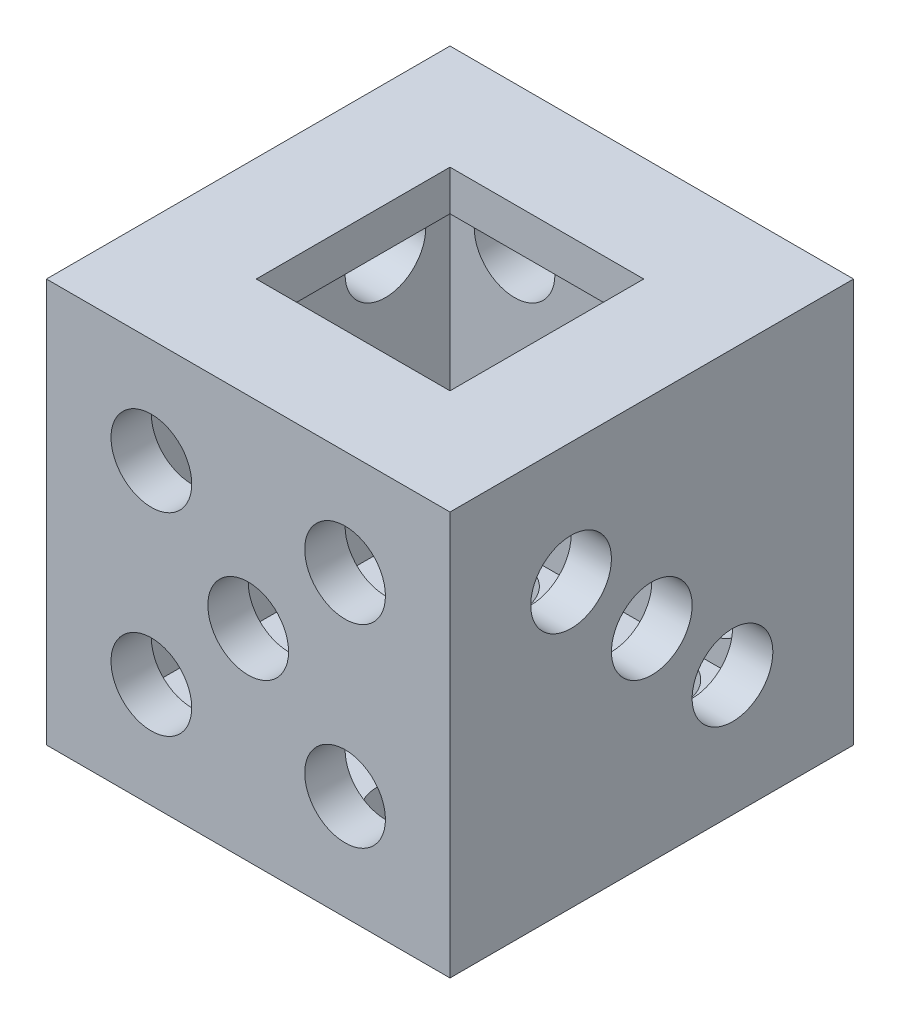
ISO-10303-21;
HEADER;
FILE_DESCRIPTION(('STEP AP214'),'2;1');
FILE_NAME('part.step','',(''),(''),'','','');
FILE_SCHEMA(('AUTOMOTIVE_DESIGN { 1 0 10303 214 1 1 1 1 }'));
ENDSEC;
DATA;
#1=APPLICATION_CONTEXT('core data for automotive mechanical design processes');
#2=APPLICATION_PROTOCOL_DEFINITION('international standard','automotive_design',2000,#1);
#3=PRODUCT_CONTEXT('',#1,'mechanical');
#4=PRODUCT('Part','Part','',(#3));
#5=PRODUCT_RELATED_PRODUCT_CATEGORY('part','',(#4));
#6=PRODUCT_DEFINITION_FORMATION('','',#4);
#7=PRODUCT_DEFINITION_CONTEXT('part definition',#1,'design');
#8=PRODUCT_DEFINITION('design','',#6,#7);
#9=PRODUCT_DEFINITION_SHAPE('','',#8);
#10=(LENGTH_UNIT() NAMED_UNIT(*) SI_UNIT(.MILLI.,.METRE.));
#11=(NAMED_UNIT(*) PLANE_ANGLE_UNIT() SI_UNIT($,.RADIAN.));
#12=(NAMED_UNIT(*) SI_UNIT($,.STERADIAN.) SOLID_ANGLE_UNIT());
#13=UNCERTAINTY_MEASURE_WITH_UNIT(LENGTH_MEASURE(1.E-05),#10,'distance_accuracy_value','');
#14=(GEOMETRIC_REPRESENTATION_CONTEXT(3) GLOBAL_UNCERTAINTY_ASSIGNED_CONTEXT((#13)) GLOBAL_UNIT_ASSIGNED_CONTEXT((#10,
#11,#12)) REPRESENTATION_CONTEXT('',''));
#15=CARTESIAN_POINT('',(0.,0.,0.));
#16=DIRECTION('',(0.,0.,1.));
#17=DIRECTION('',(1.,0.,0.));
#18=AXIS2_PLACEMENT_3D('',#15,#16,#17);
#19=CARTESIAN_POINT('',(10.,25.,-12.5));
#20=DIRECTION('',(-1.,0.,0.));
#21=DIRECTION('',(0.,0.,1.));
#22=AXIS2_PLACEMENT_3D('',#19,#20,#21);
#23=PLANE('',#22);
#24=CARTESIAN_POINT('',(10.,7.50000000000005,-5.));
#25=DIRECTION('',(-1.,0.,0.));
#26=DIRECTION('',(0.,0.,1.));
#27=AXIS2_PLACEMENT_3D('',#24,#25,#26);
#28=CIRCLE('',#27,2.5);
#29=CARTESIAN_POINT('',(10.,7.50000000000005,-2.5));
#30=VERTEX_POINT('',#29);
#31=EDGE_CURVE('E706',#30,#30,#28,.T.);
#32=ORIENTED_EDGE('',*,*,#31,.F.);
#33=EDGE_LOOP('',(#32));
#34=FACE_BOUND('',#33,.T.);
#35=CARTESIAN_POINT('',(10.,12.5,0.));
#36=DIRECTION('',(-1.,0.,0.));
#37=DIRECTION('',(0.,0.,1.));
#38=AXIS2_PLACEMENT_3D('',#35,#36,#37);
#39=CIRCLE('',#38,2.5);
#40=CARTESIAN_POINT('',(10.,12.5,2.5));
#41=VERTEX_POINT('',#40);
#42=EDGE_CURVE('E702',#41,#41,#39,.T.);
#43=ORIENTED_EDGE('',*,*,#42,.F.);
#44=EDGE_LOOP('',(#43));
#45=FACE_BOUND('',#44,.T.);
#46=CARTESIAN_POINT('',(10.,17.5,5.));
#47=DIRECTION('',(-1.,0.,0.));
#48=DIRECTION('',(0.,0.,1.));
#49=AXIS2_PLACEMENT_3D('',#46,#47,#48);
#50=CIRCLE('',#49,2.5);
#51=CARTESIAN_POINT('',(10.,17.5,7.5));
#52=VERTEX_POINT('',#51);
#53=EDGE_CURVE('E714',#52,#52,#50,.T.);
#54=ORIENTED_EDGE('',*,*,#53,.F.);
#55=EDGE_LOOP('',(#54));
#56=FACE_BOUND('',#55,.T.);
#57=DIRECTION('',(0.,0.,-1.));
#58=VECTOR('',#57,1.);
#59=CARTESIAN_POINT('',(10.,2.5,-12.5));
#60=LINE('',#59,#58);
#61=CARTESIAN_POINT('',(10.,2.5,10.));
#62=VERTEX_POINT('',#61);
#63=CARTESIAN_POINT('',(10.,2.5,-10.));
#64=VERTEX_POINT('',#63);
#65=EDGE_CURVE('E206',#62,#64,#60,.T.);
#66=ORIENTED_EDGE('',*,*,#65,.F.);
#67=DIRECTION('',(0.,-1.,0.));
#68=VECTOR('',#67,1.);
#69=CARTESIAN_POINT('',(10.,25.,10.));
#70=LINE('',#69,#68);
#71=CARTESIAN_POINT('',(10.,22.5,10.));
#72=VERTEX_POINT('',#71);
#73=EDGE_CURVE('E242',#72,#62,#70,.T.);
#74=ORIENTED_EDGE('',*,*,#73,.F.);
#75=DIRECTION('',(0.,0.,-1.));
#76=VECTOR('',#75,1.);
#77=CARTESIAN_POINT('',(10.,22.5,-12.5));
#78=LINE('',#77,#76);
#79=CARTESIAN_POINT('',(10.,22.5,-10.));
#80=VERTEX_POINT('',#79);
#81=EDGE_CURVE('E217',#72,#80,#78,.T.);
#82=ORIENTED_EDGE('',*,*,#81,.T.);
#83=DIRECTION('',(0.,-1.,0.));
#84=VECTOR('',#83,1.);
#85=CARTESIAN_POINT('',(10.,25.,-10.));
#86=LINE('',#85,#84);
#87=EDGE_CURVE('E235',#80,#64,#86,.T.);
#88=ORIENTED_EDGE('',*,*,#87,.T.);
#89=EDGE_LOOP('',(#66,#74,#82,#88));
#90=FACE_BOUND('',#89,.T.);
#91=ADVANCED_FACE('F39',(#34,#45,#56,#90),#23,.T.);
#92=CARTESIAN_POINT('',(-12.5,25.,-10.));
#93=DIRECTION('',(0.,0.,1.));
#94=DIRECTION('',(1.,0.,0.));
#95=AXIS2_PLACEMENT_3D('',#92,#93,#94);
#96=PLANE('',#95);
#97=CARTESIAN_POINT('',(6.,6.5,-10.));
#98=DIRECTION('',(0.,0.,1.));
#99=DIRECTION('',(1.,0.,0.));
#100=AXIS2_PLACEMENT_3D('',#97,#98,#99);
#101=CIRCLE('',#100,2.5);
#102=CARTESIAN_POINT('',(8.5,6.5,-10.));
#103=VERTEX_POINT('',#102);
#104=EDGE_CURVE('E605',#103,#103,#101,.T.);
#105=ORIENTED_EDGE('',*,*,#104,.F.);
#106=EDGE_LOOP('',(#105));
#107=FACE_BOUND('',#106,.T.);
#108=CARTESIAN_POINT('',(-6.,18.5,-10.));
#109=DIRECTION('',(0.,0.,1.));
#110=DIRECTION('',(1.,0.,0.));
#111=AXIS2_PLACEMENT_3D('',#108,#109,#110);
#112=CIRCLE('',#111,2.5);
#113=CARTESIAN_POINT('',(-3.5,18.5,-10.));
#114=VERTEX_POINT('',#113);
#115=EDGE_CURVE('E610',#114,#114,#112,.T.);
#116=ORIENTED_EDGE('',*,*,#115,.F.);
#117=EDGE_LOOP('',(#116));
#118=FACE_BOUND('',#117,.T.);
#119=DIRECTION('',(-1.,0.,0.));
#120=VECTOR('',#119,1.);
#121=CARTESIAN_POINT('',(-12.5,2.5,-10.));
#122=LINE('',#121,#120);
#123=CARTESIAN_POINT('',(-10.,2.5,-10.));
#124=VERTEX_POINT('',#123);
#125=EDGE_CURVE('E239',#64,#124,#122,.T.);
#126=ORIENTED_EDGE('',*,*,#125,.F.);
#127=ORIENTED_EDGE('',*,*,#87,.F.);
#128=DIRECTION('',(-1.,0.,0.));
#129=VECTOR('',#128,1.);
#130=CARTESIAN_POINT('',(-12.5,22.5,-10.));
#131=LINE('',#130,#129);
#132=CARTESIAN_POINT('',(-10.,22.5,-10.));
#133=VERTEX_POINT('',#132);
#134=EDGE_CURVE('E214',#80,#133,#131,.T.);
#135=ORIENTED_EDGE('',*,*,#134,.T.);
#136=DIRECTION('',(0.,-1.,0.));
#137=VECTOR('',#136,1.);
#138=CARTESIAN_POINT('',(-10.,25.,-10.));
#139=LINE('',#138,#137);
#140=EDGE_CURVE('E228',#133,#124,#139,.T.);
#141=ORIENTED_EDGE('',*,*,#140,.T.);
#142=EDGE_LOOP('',(#126,#127,#135,#141));
#143=FACE_BOUND('',#142,.T.);
#144=ADVANCED_FACE('F272',(#107,#118,#143),#96,.T.);
#145=CARTESIAN_POINT('',(-10.,25.,-12.5));
#146=DIRECTION('',(1.,0.,0.));
#147=DIRECTION('',(0.,0.,-1.));
#148=AXIS2_PLACEMENT_3D('',#145,#146,#147);
#149=PLANE('',#148);
#150=CARTESIAN_POINT('',(-10.,6.5,-6.));
#151=DIRECTION('',(1.,0.,0.));
#152=DIRECTION('',(0.,0.,-1.));
#153=AXIS2_PLACEMENT_3D('',#150,#151,#152);
#154=CIRCLE('',#153,2.5);
#155=CARTESIAN_POINT('',(-10.,6.5,-8.5));
#156=VERTEX_POINT('',#155);
#157=EDGE_CURVE('E674',#156,#156,#154,.T.);
#158=ORIENTED_EDGE('',*,*,#157,.F.);
#159=EDGE_LOOP('',(#158));
#160=FACE_BOUND('',#159,.T.);
#161=CARTESIAN_POINT('',(-10.,6.5,6.));
#162=DIRECTION('',(1.,0.,0.));
#163=DIRECTION('',(0.,0.,-1.));
#164=AXIS2_PLACEMENT_3D('',#161,#162,#163);
#165=CIRCLE('',#164,2.5);
#166=CARTESIAN_POINT('',(-10.,6.5,3.5));
#167=VERTEX_POINT('',#166);
#168=EDGE_CURVE('E667',#167,#167,#165,.T.);
#169=ORIENTED_EDGE('',*,*,#168,.F.);
#170=EDGE_LOOP('',(#169));
#171=FACE_BOUND('',#170,.T.);
#172=CARTESIAN_POINT('',(-10.,18.5,6.));
#173=DIRECTION('',(1.,0.,0.));
#174=DIRECTION('',(0.,0.,-1.));
#175=AXIS2_PLACEMENT_3D('',#172,#173,#174);
#176=CIRCLE('',#175,2.5);
#177=CARTESIAN_POINT('',(-10.,18.5,3.5));
#178=VERTEX_POINT('',#177);
#179=EDGE_CURVE('E682',#178,#178,#176,.T.);
#180=ORIENTED_EDGE('',*,*,#179,.F.);
#181=EDGE_LOOP('',(#180));
#182=FACE_BOUND('',#181,.T.);
#183=CARTESIAN_POINT('',(-10.,18.5,-6.));
#184=DIRECTION('',(1.,0.,0.));
#185=DIRECTION('',(0.,0.,-1.));
#186=AXIS2_PLACEMENT_3D('',#183,#184,#185);
#187=CIRCLE('',#186,2.5);
#188=CARTESIAN_POINT('',(-10.,18.5,-8.5));
#189=VERTEX_POINT('',#188);
#190=EDGE_CURVE('E690',#189,#189,#187,.T.);
#191=ORIENTED_EDGE('',*,*,#190,.F.);
#192=EDGE_LOOP('',(#191));
#193=FACE_BOUND('',#192,.T.);
#194=DIRECTION('',(0.,0.,1.));
#195=VECTOR('',#194,1.);
#196=CARTESIAN_POINT('',(-10.,2.5,-12.5));
#197=LINE('',#196,#195);
#198=CARTESIAN_POINT('',(-10.,2.5,10.));
#199=VERTEX_POINT('',#198);
#200=EDGE_CURVE('E232',#124,#199,#197,.T.);
#201=ORIENTED_EDGE('',*,*,#200,.F.);
#202=ORIENTED_EDGE('',*,*,#140,.F.);
#203=DIRECTION('',(0.,0.,1.));
#204=VECTOR('',#203,1.);
#205=CARTESIAN_POINT('',(-10.,22.5,-12.5));
#206=LINE('',#205,#204);
#207=CARTESIAN_POINT('',(-10.,22.5,10.));
#208=VERTEX_POINT('',#207);
#209=EDGE_CURVE('E211',#133,#208,#206,.T.);
#210=ORIENTED_EDGE('',*,*,#209,.T.);
#211=DIRECTION('',(0.,-1.,0.));
#212=VECTOR('',#211,1.);
#213=CARTESIAN_POINT('',(-10.,25.,10.));
#214=LINE('',#213,#212);
#215=EDGE_CURVE('E221',#208,#199,#214,.T.);
#216=ORIENTED_EDGE('',*,*,#215,.T.);
#217=EDGE_LOOP('',(#201,#202,#210,#216));
#218=FACE_BOUND('',#217,.T.);
#219=ADVANCED_FACE('F278',(#160,#171,#182,#193,#218),#149,.T.);
#220=CARTESIAN_POINT('',(-12.5,25.,10.));
#221=DIRECTION('',(0.,0.,-1.));
#222=DIRECTION('',(-1.,0.,0.));
#223=AXIS2_PLACEMENT_3D('',#220,#221,#222);
#224=PLANE('',#223);
#225=CARTESIAN_POINT('',(6.,6.5,10.));
#226=DIRECTION('',(0.,0.,-1.));
#227=DIRECTION('',(-1.,0.,0.));
#228=AXIS2_PLACEMENT_3D('',#225,#226,#227);
#229=CIRCLE('',#228,2.5);
#230=CARTESIAN_POINT('',(3.5,6.5,10.));
#231=VERTEX_POINT('',#230);
#232=EDGE_CURVE('E658',#231,#231,#229,.T.);
#233=ORIENTED_EDGE('',*,*,#232,.F.);
#234=EDGE_LOOP('',(#233));
#235=FACE_BOUND('',#234,.T.);
#236=CARTESIAN_POINT('',(-6.,6.5,10.));
#237=DIRECTION('',(0.,0.,-1.));
#238=DIRECTION('',(-1.,0.,0.));
#239=AXIS2_PLACEMENT_3D('',#236,#237,#238);
#240=CIRCLE('',#239,2.5);
#241=CARTESIAN_POINT('',(-8.5,6.5,10.));
#242=VERTEX_POINT('',#241);
#243=EDGE_CURVE('E654',#242,#242,#240,.T.);
#244=ORIENTED_EDGE('',*,*,#243,.F.);
#245=EDGE_LOOP('',(#244));
#246=FACE_BOUND('',#245,.T.);
#247=CARTESIAN_POINT('',(-6.,18.5,10.));
#248=DIRECTION('',(0.,0.,-1.));
#249=DIRECTION('',(-1.,0.,0.));
#250=AXIS2_PLACEMENT_3D('',#247,#248,#249);
#251=CIRCLE('',#250,2.5);
#252=CARTESIAN_POINT('',(-8.5,18.5,10.));
#253=VERTEX_POINT('',#252);
#254=EDGE_CURVE('E650',#253,#253,#251,.T.);
#255=ORIENTED_EDGE('',*,*,#254,.F.);
#256=EDGE_LOOP('',(#255));
#257=FACE_BOUND('',#256,.T.);
#258=CARTESIAN_POINT('',(6.,18.5,10.));
#259=DIRECTION('',(0.,0.,-1.));
#260=DIRECTION('',(-1.,0.,0.));
#261=AXIS2_PLACEMENT_3D('',#258,#259,#260);
#262=CIRCLE('',#261,2.5);
#263=CARTESIAN_POINT('',(3.5,18.5,10.));
#264=VERTEX_POINT('',#263);
#265=EDGE_CURVE('E646',#264,#264,#262,.T.);
#266=ORIENTED_EDGE('',*,*,#265,.F.);
#267=EDGE_LOOP('',(#266));
#268=FACE_BOUND('',#267,.T.);
#269=CARTESIAN_POINT('',(0.,12.5,10.));
#270=DIRECTION('',(0.,0.,-1.));
#271=DIRECTION('',(-1.,0.,0.));
#272=AXIS2_PLACEMENT_3D('',#269,#270,#271);
#273=CIRCLE('',#272,2.5);
#274=CARTESIAN_POINT('',(-2.5,12.5,10.));
#275=VERTEX_POINT('',#274);
#276=EDGE_CURVE('E642',#275,#275,#273,.T.);
#277=ORIENTED_EDGE('',*,*,#276,.F.);
#278=EDGE_LOOP('',(#277));
#279=FACE_BOUND('',#278,.T.);
#280=DIRECTION('',(1.,0.,0.));
#281=VECTOR('',#280,1.);
#282=CARTESIAN_POINT('',(-12.5,2.5,10.));
#283=LINE('',#282,#281);
#284=EDGE_CURVE('E225',#199,#62,#283,.T.);
#285=ORIENTED_EDGE('',*,*,#284,.F.);
#286=ORIENTED_EDGE('',*,*,#215,.F.);
#287=DIRECTION('',(1.,0.,0.));
#288=VECTOR('',#287,1.);
#289=CARTESIAN_POINT('',(-12.5,22.5,10.));
#290=LINE('',#289,#288);
#291=EDGE_CURVE('E207',#208,#72,#290,.T.);
#292=ORIENTED_EDGE('',*,*,#291,.T.);
#293=ORIENTED_EDGE('',*,*,#73,.T.);
#294=EDGE_LOOP('',(#285,#286,#292,#293));
#295=FACE_BOUND('',#294,.T.);
#296=ADVANCED_FACE('F289',(#235,#246,#257,#268,#279,#295),#224,.T.);
#297=CARTESIAN_POINT('',(0.,22.5,0.));
#298=DIRECTION('',(0.,1.,0.));
#299=DIRECTION('',(0.,0.,1.));
#300=AXIS2_PLACEMENT_3D('',#297,#298,#299);
#301=PLANE('',#300);
#302=DIRECTION('',(1.,0.,0.));
#303=VECTOR('',#302,1.);
#304=CARTESIAN_POINT('',(0.,22.5,6.));
#305=LINE('',#304,#303);
#306=CARTESIAN_POINT('',(-6.,22.5,6.));
#307=VERTEX_POINT('',#306);
#308=CARTESIAN_POINT('',(6.,22.5,6.));
#309=VERTEX_POINT('',#308);
#310=EDGE_CURVE('E48',#307,#309,#305,.T.);
#311=ORIENTED_EDGE('',*,*,#310,.T.);
#312=DIRECTION('',(0.,0.,-1.));
#313=VECTOR('',#312,1.);
#314=CARTESIAN_POINT('',(6.,22.5,0.));
#315=LINE('',#314,#313);
#316=CARTESIAN_POINT('',(6.,22.5,-6.));
#317=VERTEX_POINT('',#316);
#318=EDGE_CURVE('E11',#309,#317,#315,.T.);
#319=ORIENTED_EDGE('',*,*,#318,.T.);
#320=DIRECTION('',(-1.,0.,0.));
#321=VECTOR('',#320,1.);
#322=CARTESIAN_POINT('',(0.,22.5,-6.));
#323=LINE('',#322,#321);
#324=CARTESIAN_POINT('',(-6.,22.5,-6.));
#325=VERTEX_POINT('',#324);
#326=EDGE_CURVE('E210',#317,#325,#323,.T.);
#327=ORIENTED_EDGE('',*,*,#326,.T.);
#328=DIRECTION('',(0.,0.,1.));
#329=VECTOR('',#328,1.);
#330=CARTESIAN_POINT('',(-6.,22.5,0.));
#331=LINE('',#330,#329);
#332=EDGE_CURVE('E135',#325,#307,#331,.T.);
#333=ORIENTED_EDGE('',*,*,#332,.T.);
#334=EDGE_LOOP('',(#311,#319,#327,#333));
#335=FACE_BOUND('',#334,.T.);
#336=ORIENTED_EDGE('',*,*,#81,.F.);
#337=ORIENTED_EDGE('',*,*,#291,.F.);
#338=ORIENTED_EDGE('',*,*,#209,.F.);
#339=ORIENTED_EDGE('',*,*,#134,.F.);
#340=EDGE_LOOP('',(#336,#337,#338,#339));
#341=FACE_BOUND('',#340,.T.);
#342=ADVANCED_FACE('F255',(#335,#341),#301,.F.);
#343=CARTESIAN_POINT('',(0.,2.5,0.));
#344=DIRECTION('',(0.,1.,0.));
#345=DIRECTION('',(0.,0.,1.));
#346=AXIS2_PLACEMENT_3D('',#343,#344,#345);
#347=PLANE('',#346);
#348=CARTESIAN_POINT('',(-5.,2.5,0.));
#349=DIRECTION('',(0.,1.,0.));
#350=DIRECTION('',(0.,0.,1.));
#351=AXIS2_PLACEMENT_3D('',#348,#349,#350);
#352=CIRCLE('',#351,2.5);
#353=CARTESIAN_POINT('',(-5.,2.5,2.5));
#354=VERTEX_POINT('',#353);
#355=EDGE_CURVE('E762',#354,#354,#352,.T.);
#356=ORIENTED_EDGE('',*,*,#355,.F.);
#357=EDGE_LOOP('',(#356));
#358=FACE_BOUND('',#357,.T.);
#359=CARTESIAN_POINT('',(-5.,2.5,-7.));
#360=DIRECTION('',(0.,1.,0.));
#361=DIRECTION('',(0.,0.,1.));
#362=AXIS2_PLACEMENT_3D('',#359,#360,#361);
#363=CIRCLE('',#362,2.5);
#364=CARTESIAN_POINT('',(-5.,2.5,-4.5));
#365=VERTEX_POINT('',#364);
#366=EDGE_CURVE('E758',#365,#365,#363,.T.);
#367=ORIENTED_EDGE('',*,*,#366,.F.);
#368=EDGE_LOOP('',(#367));
#369=FACE_BOUND('',#368,.T.);
#370=CARTESIAN_POINT('',(5.,2.5,7.));
#371=DIRECTION('',(0.,1.,0.));
#372=DIRECTION('',(0.,0.,1.));
#373=AXIS2_PLACEMENT_3D('',#370,#371,#372);
#374=CIRCLE('',#373,2.5);
#375=CARTESIAN_POINT('',(5.,2.5,9.5));
#376=VERTEX_POINT('',#375);
#377=EDGE_CURVE('E754',#376,#376,#374,.T.);
#378=ORIENTED_EDGE('',*,*,#377,.F.);
#379=EDGE_LOOP('',(#378));
#380=FACE_BOUND('',#379,.T.);
#381=CARTESIAN_POINT('',(5.,2.5,0.));
#382=DIRECTION('',(0.,1.,0.));
#383=DIRECTION('',(0.,0.,1.));
#384=AXIS2_PLACEMENT_3D('',#381,#382,#383);
#385=CIRCLE('',#384,2.5);
#386=CARTESIAN_POINT('',(5.,2.5,2.5));
#387=VERTEX_POINT('',#386);
#388=EDGE_CURVE('E750',#387,#387,#385,.T.);
#389=ORIENTED_EDGE('',*,*,#388,.F.);
#390=EDGE_LOOP('',(#389));
#391=FACE_BOUND('',#390,.T.);
#392=CARTESIAN_POINT('',(5.,2.5,-7.));
#393=DIRECTION('',(0.,1.,0.));
#394=DIRECTION('',(0.,0.,1.));
#395=AXIS2_PLACEMENT_3D('',#392,#393,#394);
#396=CIRCLE('',#395,2.5);
#397=CARTESIAN_POINT('',(5.,2.5,-4.5));
#398=VERTEX_POINT('',#397);
#399=EDGE_CURVE('E746',#398,#398,#396,.T.);
#400=ORIENTED_EDGE('',*,*,#399,.F.);
#401=EDGE_LOOP('',(#400));
#402=FACE_BOUND('',#401,.T.);
#403=CARTESIAN_POINT('',(-5.,2.5,7.));
#404=DIRECTION('',(0.,1.,0.));
#405=DIRECTION('',(0.,0.,1.));
#406=AXIS2_PLACEMENT_3D('',#403,#404,#405);
#407=CIRCLE('',#406,2.5);
#408=CARTESIAN_POINT('',(-5.,2.5,9.5));
#409=VERTEX_POINT('',#408);
#410=EDGE_CURVE('E742',#409,#409,#407,.T.);
#411=ORIENTED_EDGE('',*,*,#410,.F.);
#412=EDGE_LOOP('',(#411));
#413=FACE_BOUND('',#412,.T.);
#414=ORIENTED_EDGE('',*,*,#65,.T.);
#415=ORIENTED_EDGE('',*,*,#125,.T.);
#416=ORIENTED_EDGE('',*,*,#200,.T.);
#417=ORIENTED_EDGE('',*,*,#284,.T.);
#418=EDGE_LOOP('',(#414,#415,#416,#417));
#419=FACE_BOUND('',#418,.T.);
#420=ADVANCED_FACE('F41',(#358,#369,#380,#391,#402,#413,#419),#347,.T.);
#421=CARTESIAN_POINT('',(6.,10.,-6.));
#422=DIRECTION('',(1.,0.,0.));
#423=DIRECTION('',(0.,0.,-1.));
#424=AXIS2_PLACEMENT_3D('',#421,#422,#423);
#425=PLANE('',#424);
#426=DIRECTION('',(0.,1.,0.));
#427=VECTOR('',#426,1.);
#428=CARTESIAN_POINT('',(6.,10.,6.));
#429=LINE('',#428,#427);
#430=CARTESIAN_POINT('',(6.,25.,6.));
#431=VERTEX_POINT('',#430);
#432=EDGE_CURVE('E157',#309,#431,#429,.T.);
#433=ORIENTED_EDGE('',*,*,#432,.T.);
#434=DIRECTION('',(0.,0.,-1.));
#435=VECTOR('',#434,1.);
#436=CARTESIAN_POINT('',(6.,25.,-6.));
#437=LINE('',#436,#435);
#438=CARTESIAN_POINT('',(6.,25.,-6.));
#439=VERTEX_POINT('',#438);
#440=EDGE_CURVE('E55',#431,#439,#437,.T.);
#441=ORIENTED_EDGE('',*,*,#440,.T.);
#442=DIRECTION('',(0.,1.,0.));
#443=VECTOR('',#442,1.);
#444=CARTESIAN_POINT('',(6.,10.,-6.));
#445=LINE('',#444,#443);
#446=EDGE_CURVE('E139',#317,#439,#445,.T.);
#447=ORIENTED_EDGE('',*,*,#446,.F.);
#448=ORIENTED_EDGE('',*,*,#318,.F.);
#449=EDGE_LOOP('',(#433,#441,#447,#448));
#450=FACE_BOUND('',#449,.T.);
#451=ADVANCED_FACE('F260',(#450),#425,.F.);
#452=CARTESIAN_POINT('',(-6.,10.,6.));
#453=DIRECTION('',(0.,0.,1.));
#454=DIRECTION('',(1.,0.,0.));
#455=AXIS2_PLACEMENT_3D('',#452,#453,#454);
#456=PLANE('',#455);
#457=DIRECTION('',(0.,1.,0.));
#458=VECTOR('',#457,1.);
#459=CARTESIAN_POINT('',(-6.,10.,6.));
#460=LINE('',#459,#458);
#461=CARTESIAN_POINT('',(-6.,25.,6.));
#462=VERTEX_POINT('',#461);
#463=EDGE_CURVE('E138',#307,#462,#460,.T.);
#464=ORIENTED_EDGE('',*,*,#463,.T.);
#465=DIRECTION('',(1.,0.,0.));
#466=VECTOR('',#465,1.);
#467=CARTESIAN_POINT('',(-6.,25.,6.));
#468=LINE('',#467,#466);
#469=EDGE_CURVE('E150',#462,#431,#468,.T.);
#470=ORIENTED_EDGE('',*,*,#469,.T.);
#471=ORIENTED_EDGE('',*,*,#432,.F.);
#472=ORIENTED_EDGE('',*,*,#310,.F.);
#473=EDGE_LOOP('',(#464,#470,#471,#472));
#474=FACE_BOUND('',#473,.T.);
#475=ADVANCED_FACE('F259',(#474),#456,.F.);
#476=CARTESIAN_POINT('',(-6.,10.,-6.));
#477=DIRECTION('',(-1.,0.,0.));
#478=DIRECTION('',(0.,0.,1.));
#479=AXIS2_PLACEMENT_3D('',#476,#477,#478);
#480=PLANE('',#479);
#481=DIRECTION('',(0.,1.,0.));
#482=VECTOR('',#481,1.);
#483=CARTESIAN_POINT('',(-6.,10.,-6.));
#484=LINE('',#483,#482);
#485=CARTESIAN_POINT('',(-6.,25.,-6.));
#486=VERTEX_POINT('',#485);
#487=EDGE_CURVE('E63',#325,#486,#484,.T.);
#488=ORIENTED_EDGE('',*,*,#487,.T.);
#489=DIRECTION('',(0.,0.,1.));
#490=VECTOR('',#489,1.);
#491=CARTESIAN_POINT('',(-6.,25.,-6.));
#492=LINE('',#491,#490);
#493=EDGE_CURVE('E132',#486,#462,#492,.T.);
#494=ORIENTED_EDGE('',*,*,#493,.T.);
#495=ORIENTED_EDGE('',*,*,#463,.F.);
#496=ORIENTED_EDGE('',*,*,#332,.F.);
#497=EDGE_LOOP('',(#488,#494,#495,#496));
#498=FACE_BOUND('',#497,.T.);
#499=ADVANCED_FACE('F129',(#498),#480,.F.);
#500=CARTESIAN_POINT('',(-6.,10.,-6.));
#501=DIRECTION('',(0.,0.,-1.));
#502=DIRECTION('',(-1.,0.,0.));
#503=AXIS2_PLACEMENT_3D('',#500,#501,#502);
#504=PLANE('',#503);
#505=ORIENTED_EDGE('',*,*,#446,.T.);
#506=DIRECTION('',(-1.,0.,0.));
#507=VECTOR('',#506,1.);
#508=CARTESIAN_POINT('',(-6.,25.,-6.));
#509=LINE('',#508,#507);
#510=EDGE_CURVE('E142',#439,#486,#509,.T.);
#511=ORIENTED_EDGE('',*,*,#510,.T.);
#512=ORIENTED_EDGE('',*,*,#487,.F.);
#513=ORIENTED_EDGE('',*,*,#326,.F.);
#514=EDGE_LOOP('',(#505,#511,#512,#513));
#515=FACE_BOUND('',#514,.T.);
#516=ADVANCED_FACE('F143',(#515),#504,.F.);
#517=CARTESIAN_POINT('',(12.5,25.,-12.5));
#518=DIRECTION('',(-1.,0.,0.));
#519=DIRECTION('',(0.,0.,1.));
#520=AXIS2_PLACEMENT_3D('',#517,#518,#519);
#521=PLANE('',#520);
#522=CARTESIAN_POINT('',(12.5,7.50000000000005,-5.));
#523=DIRECTION('',(1.,0.,0.));
#524=DIRECTION('',(0.,0.,-1.));
#525=AXIS2_PLACEMENT_3D('',#522,#523,#524);
#526=CIRCLE('',#525,2.5);
#527=CARTESIAN_POINT('',(12.5,7.50000000000005,-7.5));
#528=VERTEX_POINT('',#527);
#529=EDGE_CURVE('E694',#528,#528,#526,.T.);
#530=ORIENTED_EDGE('',*,*,#529,.F.);
#531=EDGE_LOOP('',(#530));
#532=FACE_BOUND('',#531,.T.);
#533=CARTESIAN_POINT('',(12.5,12.5,0.));
#534=DIRECTION('',(1.,0.,0.));
#535=DIRECTION('',(0.,0.,-1.));
#536=AXIS2_PLACEMENT_3D('',#533,#534,#535);
#537=CIRCLE('',#536,2.5);
#538=CARTESIAN_POINT('',(12.5,12.5,-2.5));
#539=VERTEX_POINT('',#538);
#540=EDGE_CURVE('E698',#539,#539,#537,.T.);
#541=ORIENTED_EDGE('',*,*,#540,.F.);
#542=EDGE_LOOP('',(#541));
#543=FACE_BOUND('',#542,.T.);
#544=CARTESIAN_POINT('',(12.5,17.5,5.));
#545=DIRECTION('',(1.,0.,0.));
#546=DIRECTION('',(0.,0.,-1.));
#547=AXIS2_PLACEMENT_3D('',#544,#545,#546);
#548=CIRCLE('',#547,2.5);
#549=CARTESIAN_POINT('',(12.5,17.5,2.5));
#550=VERTEX_POINT('',#549);
#551=EDGE_CURVE('E710',#550,#550,#548,.T.);
#552=ORIENTED_EDGE('',*,*,#551,.F.);
#553=EDGE_LOOP('',(#552));
#554=FACE_BOUND('',#553,.T.);
#555=DIRECTION('',(0.,0.,-1.));
#556=VECTOR('',#555,1.);
#557=CARTESIAN_POINT('',(12.5,0.,-12.5));
#558=LINE('',#557,#556);
#559=CARTESIAN_POINT('',(12.5,0.,12.5));
#560=VERTEX_POINT('',#559);
#561=CARTESIAN_POINT('',(12.5,0.,-12.5));
#562=VERTEX_POINT('',#561);
#563=EDGE_CURVE('E160',#560,#562,#558,.T.);
#564=ORIENTED_EDGE('',*,*,#563,.T.);
#565=DIRECTION('',(0.,-1.,0.));
#566=VECTOR('',#565,1.);
#567=CARTESIAN_POINT('',(12.5,25.,-12.5));
#568=LINE('',#567,#566);
#569=CARTESIAN_POINT('',(12.5,25.,-12.5));
#570=VERTEX_POINT('',#569);
#571=EDGE_CURVE('E202',#570,#562,#568,.T.);
#572=ORIENTED_EDGE('',*,*,#571,.F.);
#573=DIRECTION('',(0.,0.,-1.));
#574=VECTOR('',#573,1.);
#575=CARTESIAN_POINT('',(12.5,25.,-12.5));
#576=LINE('',#575,#574);
#577=CARTESIAN_POINT('',(12.5,25.,12.5));
#578=VERTEX_POINT('',#577);
#579=EDGE_CURVE('E165',#578,#570,#576,.T.);
#580=ORIENTED_EDGE('',*,*,#579,.F.);
#581=DIRECTION('',(0.,-1.,0.));
#582=VECTOR('',#581,1.);
#583=CARTESIAN_POINT('',(12.5,25.,12.5));
#584=LINE('',#583,#582);
#585=EDGE_CURVE('E179',#578,#560,#584,.T.);
#586=ORIENTED_EDGE('',*,*,#585,.T.);
#587=EDGE_LOOP('',(#564,#572,#580,#586));
#588=FACE_BOUND('',#587,.T.);
#589=ADVANCED_FACE('F284',(#532,#543,#554,#588),#521,.F.);
#590=CARTESIAN_POINT('',(-12.5,25.,-12.5));
#591=DIRECTION('',(0.,0.,1.));
#592=DIRECTION('',(1.,0.,0.));
#593=AXIS2_PLACEMENT_3D('',#590,#591,#592);
#594=PLANE('',#593);
#595=CARTESIAN_POINT('',(6.,6.5,-12.5));
#596=DIRECTION('',(0.,0.,-1.));
#597=DIRECTION('',(-1.,0.,0.));
#598=AXIS2_PLACEMENT_3D('',#595,#596,#597);
#599=CIRCLE('',#598,2.5);
#600=CARTESIAN_POINT('',(3.5,6.5,-12.5));
#601=VERTEX_POINT('',#600);
#602=EDGE_CURVE('E608',#601,#601,#599,.T.);
#603=ORIENTED_EDGE('',*,*,#602,.F.);
#604=EDGE_LOOP('',(#603));
#605=FACE_BOUND('',#604,.T.);
#606=CARTESIAN_POINT('',(-6.,18.5,-12.5));
#607=DIRECTION('',(0.,0.,-1.));
#608=DIRECTION('',(-1.,0.,0.));
#609=AXIS2_PLACEMENT_3D('',#606,#607,#608);
#610=CIRCLE('',#609,2.5);
#611=CARTESIAN_POINT('',(-8.5,18.5,-12.5));
#612=VERTEX_POINT('',#611);
#613=EDGE_CURVE('E611',#612,#612,#610,.T.);
#614=ORIENTED_EDGE('',*,*,#613,.F.);
#615=EDGE_LOOP('',(#614));
#616=FACE_BOUND('',#615,.T.);
#617=DIRECTION('',(-1.,0.,0.));
#618=VECTOR('',#617,1.);
#619=CARTESIAN_POINT('',(-12.5,0.,-12.5));
#620=LINE('',#619,#618);
#621=CARTESIAN_POINT('',(-12.5,0.,-12.5));
#622=VERTEX_POINT('',#621);
#623=EDGE_CURVE('E183',#562,#622,#620,.T.);
#624=ORIENTED_EDGE('',*,*,#623,.T.);
#625=DIRECTION('',(0.,-1.,0.));
#626=VECTOR('',#625,1.);
#627=CARTESIAN_POINT('',(-12.5,25.,-12.5));
#628=LINE('',#627,#626);
#629=CARTESIAN_POINT('',(-12.5,25.,-12.5));
#630=VERTEX_POINT('',#629);
#631=EDGE_CURVE('E198',#630,#622,#628,.T.);
#632=ORIENTED_EDGE('',*,*,#631,.F.);
#633=DIRECTION('',(-1.,0.,0.));
#634=VECTOR('',#633,1.);
#635=CARTESIAN_POINT('',(-12.5,25.,-12.5));
#636=LINE('',#635,#634);
#637=EDGE_CURVE('E169',#570,#630,#636,.T.);
#638=ORIENTED_EDGE('',*,*,#637,.F.);
#639=ORIENTED_EDGE('',*,*,#571,.T.);
#640=EDGE_LOOP('',(#624,#632,#638,#639));
#641=FACE_BOUND('',#640,.T.);
#642=ADVANCED_FACE('F406',(#605,#616,#641),#594,.F.);
#643=CARTESIAN_POINT('',(-12.5,25.,-12.5));
#644=DIRECTION('',(1.,0.,0.));
#645=DIRECTION('',(0.,0.,-1.));
#646=AXIS2_PLACEMENT_3D('',#643,#644,#645);
#647=PLANE('',#646);
#648=CARTESIAN_POINT('',(-12.5,6.5,-6.));
#649=DIRECTION('',(-1.,0.,0.));
#650=DIRECTION('',(0.,0.,1.));
#651=AXIS2_PLACEMENT_3D('',#648,#649,#650);
#652=CIRCLE('',#651,2.5);
#653=CARTESIAN_POINT('',(-12.5,6.5,-3.5));
#654=VERTEX_POINT('',#653);
#655=EDGE_CURVE('E663',#654,#654,#652,.T.);
#656=ORIENTED_EDGE('',*,*,#655,.F.);
#657=EDGE_LOOP('',(#656));
#658=FACE_BOUND('',#657,.T.);
#659=CARTESIAN_POINT('',(-12.5,6.5,6.));
#660=DIRECTION('',(-1.,0.,0.));
#661=DIRECTION('',(0.,0.,1.));
#662=AXIS2_PLACEMENT_3D('',#659,#660,#661);
#663=CIRCLE('',#662,2.5);
#664=CARTESIAN_POINT('',(-12.5,6.5,8.5));
#665=VERTEX_POINT('',#664);
#666=EDGE_CURVE('E662',#665,#665,#663,.T.);
#667=ORIENTED_EDGE('',*,*,#666,.F.);
#668=EDGE_LOOP('',(#667));
#669=FACE_BOUND('',#668,.T.);
#670=CARTESIAN_POINT('',(-12.5,18.5,6.));
#671=DIRECTION('',(-1.,0.,0.));
#672=DIRECTION('',(0.,0.,1.));
#673=AXIS2_PLACEMENT_3D('',#670,#671,#672);
#674=CIRCLE('',#673,2.5);
#675=CARTESIAN_POINT('',(-12.5,18.5,8.5));
#676=VERTEX_POINT('',#675);
#677=EDGE_CURVE('E678',#676,#676,#674,.T.);
#678=ORIENTED_EDGE('',*,*,#677,.F.);
#679=EDGE_LOOP('',(#678));
#680=FACE_BOUND('',#679,.T.);
#681=CARTESIAN_POINT('',(-12.5,18.5,-6.));
#682=DIRECTION('',(-1.,0.,0.));
#683=DIRECTION('',(0.,0.,1.));
#684=AXIS2_PLACEMENT_3D('',#681,#682,#683);
#685=CIRCLE('',#684,2.5);
#686=CARTESIAN_POINT('',(-12.5,18.5,-3.5));
#687=VERTEX_POINT('',#686);
#688=EDGE_CURVE('E686',#687,#687,#685,.T.);
#689=ORIENTED_EDGE('',*,*,#688,.F.);
#690=EDGE_LOOP('',(#689));
#691=FACE_BOUND('',#690,.T.);
#692=DIRECTION('',(0.,0.,1.));
#693=VECTOR('',#692,1.);
#694=CARTESIAN_POINT('',(-12.5,0.,-12.5));
#695=LINE('',#694,#693);
#696=CARTESIAN_POINT('',(-12.5,0.,12.5));
#697=VERTEX_POINT('',#696);
#698=EDGE_CURVE('E186',#622,#697,#695,.T.);
#699=ORIENTED_EDGE('',*,*,#698,.T.);
#700=DIRECTION('',(0.,-1.,0.));
#701=VECTOR('',#700,1.);
#702=CARTESIAN_POINT('',(-12.5,25.,12.5));
#703=LINE('',#702,#701);
#704=CARTESIAN_POINT('',(-12.5,25.,12.5));
#705=VERTEX_POINT('',#704);
#706=EDGE_CURVE('E194',#705,#697,#703,.T.);
#707=ORIENTED_EDGE('',*,*,#706,.F.);
#708=DIRECTION('',(0.,0.,1.));
#709=VECTOR('',#708,1.);
#710=CARTESIAN_POINT('',(-12.5,25.,-12.5));
#711=LINE('',#710,#709);
#712=EDGE_CURVE('E173',#630,#705,#711,.T.);
#713=ORIENTED_EDGE('',*,*,#712,.F.);
#714=ORIENTED_EDGE('',*,*,#631,.T.);
#715=EDGE_LOOP('',(#699,#707,#713,#714));
#716=FACE_BOUND('',#715,.T.);
#717=ADVANCED_FACE('F461',(#658,#669,#680,#691,#716),#647,.F.);
#718=CARTESIAN_POINT('',(-12.5,25.,12.5));
#719=DIRECTION('',(0.,0.,-1.));
#720=DIRECTION('',(-1.,0.,0.));
#721=AXIS2_PLACEMENT_3D('',#718,#719,#720);
#722=PLANE('',#721);
#723=CARTESIAN_POINT('',(6.,6.5,12.5));
#724=DIRECTION('',(0.,0.,1.));
#725=DIRECTION('',(1.,0.,0.));
#726=AXIS2_PLACEMENT_3D('',#723,#724,#725);
#727=CIRCLE('',#726,2.5);
#728=CARTESIAN_POINT('',(8.5,6.5,12.5));
#729=VERTEX_POINT('',#728);
#730=EDGE_CURVE('E622',#729,#729,#727,.T.);
#731=ORIENTED_EDGE('',*,*,#730,.F.);
#732=EDGE_LOOP('',(#731));
#733=FACE_BOUND('',#732,.T.);
#734=CARTESIAN_POINT('',(-6.,6.5,12.5));
#735=DIRECTION('',(0.,0.,1.));
#736=DIRECTION('',(1.,0.,0.));
#737=AXIS2_PLACEMENT_3D('',#734,#735,#736);
#738=CIRCLE('',#737,2.5);
#739=CARTESIAN_POINT('',(-3.5,6.5,12.5));
#740=VERTEX_POINT('',#739);
#741=EDGE_CURVE('E632',#740,#740,#738,.T.);
#742=ORIENTED_EDGE('',*,*,#741,.F.);
#743=EDGE_LOOP('',(#742));
#744=FACE_BOUND('',#743,.T.);
#745=CARTESIAN_POINT('',(-6.,18.5,12.5));
#746=DIRECTION('',(0.,0.,1.));
#747=DIRECTION('',(1.,0.,0.));
#748=AXIS2_PLACEMENT_3D('',#745,#746,#747);
#749=CIRCLE('',#748,2.5);
#750=CARTESIAN_POINT('',(-3.5,18.5,12.5));
#751=VERTEX_POINT('',#750);
#752=EDGE_CURVE('E628',#751,#751,#749,.T.);
#753=ORIENTED_EDGE('',*,*,#752,.F.);
#754=EDGE_LOOP('',(#753));
#755=FACE_BOUND('',#754,.T.);
#756=CARTESIAN_POINT('',(6.,18.5,12.5));
#757=DIRECTION('',(0.,0.,1.));
#758=DIRECTION('',(1.,0.,0.));
#759=AXIS2_PLACEMENT_3D('',#756,#757,#758);
#760=CIRCLE('',#759,2.5);
#761=CARTESIAN_POINT('',(8.5,18.5,12.5));
#762=VERTEX_POINT('',#761);
#763=EDGE_CURVE('E623',#762,#762,#760,.T.);
#764=ORIENTED_EDGE('',*,*,#763,.F.);
#765=EDGE_LOOP('',(#764));
#766=FACE_BOUND('',#765,.T.);
#767=CARTESIAN_POINT('',(0.,12.5,12.5));
#768=DIRECTION('',(0.,0.,1.));
#769=DIRECTION('',(1.,0.,0.));
#770=AXIS2_PLACEMENT_3D('',#767,#768,#769);
#771=CIRCLE('',#770,2.5);
#772=CARTESIAN_POINT('',(2.5,12.5,12.5));
#773=VERTEX_POINT('',#772);
#774=EDGE_CURVE('E627',#773,#773,#771,.T.);
#775=ORIENTED_EDGE('',*,*,#774,.F.);
#776=EDGE_LOOP('',(#775));
#777=FACE_BOUND('',#776,.T.);
#778=DIRECTION('',(1.,0.,0.));
#779=VECTOR('',#778,1.);
#780=CARTESIAN_POINT('',(-12.5,0.,12.5));
#781=LINE('',#780,#779);
#782=EDGE_CURVE('E170',#697,#560,#781,.T.);
#783=ORIENTED_EDGE('',*,*,#782,.T.);
#784=ORIENTED_EDGE('',*,*,#585,.F.);
#785=DIRECTION('',(1.,0.,0.));
#786=VECTOR('',#785,1.);
#787=CARTESIAN_POINT('',(-12.5,25.,12.5));
#788=LINE('',#787,#786);
#789=EDGE_CURVE('E176',#705,#578,#788,.T.);
#790=ORIENTED_EDGE('',*,*,#789,.F.);
#791=ORIENTED_EDGE('',*,*,#706,.T.);
#792=EDGE_LOOP('',(#783,#784,#790,#791));
#793=FACE_BOUND('',#792,.T.);
#794=ADVANCED_FACE('F466',(#733,#744,#755,#766,#777,#793),#722,.F.);
#795=CARTESIAN_POINT('',(0.,25.,0.));
#796=DIRECTION('',(0.,1.,0.));
#797=DIRECTION('',(0.,0.,1.));
#798=AXIS2_PLACEMENT_3D('',#795,#796,#797);
#799=PLANE('',#798);
#800=ORIENTED_EDGE('',*,*,#440,.F.);
#801=ORIENTED_EDGE('',*,*,#469,.F.);
#802=ORIENTED_EDGE('',*,*,#493,.F.);
#803=ORIENTED_EDGE('',*,*,#510,.F.);
#804=EDGE_LOOP('',(#800,#801,#802,#803));
#805=FACE_BOUND('',#804,.T.);
#806=ORIENTED_EDGE('',*,*,#579,.T.);
#807=ORIENTED_EDGE('',*,*,#637,.T.);
#808=ORIENTED_EDGE('',*,*,#712,.T.);
#809=ORIENTED_EDGE('',*,*,#789,.T.);
#810=EDGE_LOOP('',(#806,#807,#808,#809));
#811=FACE_BOUND('',#810,.T.);
#812=ADVANCED_FACE('F147',(#805,#811),#799,.T.);
#813=CARTESIAN_POINT('',(0.,0.,0.));
#814=DIRECTION('',(0.,1.,0.));
#815=DIRECTION('',(0.,0.,1.));
#816=AXIS2_PLACEMENT_3D('',#813,#814,#815);
#817=PLANE('',#816);
#818=CARTESIAN_POINT('',(-5.,0.,0.));
#819=DIRECTION('',(0.,-1.,0.));
#820=DIRECTION('',(0.,0.,-1.));
#821=AXIS2_PLACEMENT_3D('',#818,#819,#820);
#822=CIRCLE('',#821,2.5);
#823=CARTESIAN_POINT('',(-5.,0.,-2.5));
#824=VERTEX_POINT('',#823);
#825=EDGE_CURVE('E723',#824,#824,#822,.T.);
#826=ORIENTED_EDGE('',*,*,#825,.F.);
#827=EDGE_LOOP('',(#826));
#828=FACE_BOUND('',#827,.T.);
#829=CARTESIAN_POINT('',(-5.,0.,-7.));
#830=DIRECTION('',(0.,-1.,0.));
#831=DIRECTION('',(0.,0.,-1.));
#832=AXIS2_PLACEMENT_3D('',#829,#830,#831);
#833=CIRCLE('',#832,2.5);
#834=CARTESIAN_POINT('',(-5.,0.,-9.5));
#835=VERTEX_POINT('',#834);
#836=EDGE_CURVE('E728',#835,#835,#833,.T.);
#837=ORIENTED_EDGE('',*,*,#836,.F.);
#838=EDGE_LOOP('',(#837));
#839=FACE_BOUND('',#838,.T.);
#840=CARTESIAN_POINT('',(5.,0.,7.));
#841=DIRECTION('',(0.,-1.,0.));
#842=DIRECTION('',(0.,0.,-1.));
#843=AXIS2_PLACEMENT_3D('',#840,#841,#842);
#844=CIRCLE('',#843,2.5);
#845=CARTESIAN_POINT('',(5.,0.,4.5));
#846=VERTEX_POINT('',#845);
#847=EDGE_CURVE('E732',#846,#846,#844,.T.);
#848=ORIENTED_EDGE('',*,*,#847,.F.);
#849=EDGE_LOOP('',(#848));
#850=FACE_BOUND('',#849,.T.);
#851=CARTESIAN_POINT('',(5.,0.,0.));
#852=DIRECTION('',(0.,-1.,0.));
#853=DIRECTION('',(0.,0.,-1.));
#854=AXIS2_PLACEMENT_3D('',#851,#852,#853);
#855=CIRCLE('',#854,2.5);
#856=CARTESIAN_POINT('',(5.,0.,-2.5));
#857=VERTEX_POINT('',#856);
#858=EDGE_CURVE('E722',#857,#857,#855,.T.);
#859=ORIENTED_EDGE('',*,*,#858,.F.);
#860=EDGE_LOOP('',(#859));
#861=FACE_BOUND('',#860,.T.);
#862=CARTESIAN_POINT('',(5.,0.,-7.));
#863=DIRECTION('',(0.,-1.,0.));
#864=DIRECTION('',(0.,0.,-1.));
#865=AXIS2_PLACEMENT_3D('',#862,#863,#864);
#866=CIRCLE('',#865,2.5);
#867=CARTESIAN_POINT('',(5.,0.,-9.5));
#868=VERTEX_POINT('',#867);
#869=EDGE_CURVE('E718',#868,#868,#866,.T.);
#870=ORIENTED_EDGE('',*,*,#869,.F.);
#871=EDGE_LOOP('',(#870));
#872=FACE_BOUND('',#871,.T.);
#873=CARTESIAN_POINT('',(-5.,0.,7.));
#874=DIRECTION('',(0.,-1.,0.));
#875=DIRECTION('',(0.,0.,-1.));
#876=AXIS2_PLACEMENT_3D('',#873,#874,#875);
#877=CIRCLE('',#876,2.5);
#878=CARTESIAN_POINT('',(-5.,0.,4.5));
#879=VERTEX_POINT('',#878);
#880=EDGE_CURVE('E727',#879,#879,#877,.T.);
#881=ORIENTED_EDGE('',*,*,#880,.F.);
#882=EDGE_LOOP('',(#881));
#883=FACE_BOUND('',#882,.T.);
#884=ORIENTED_EDGE('',*,*,#563,.F.);
#885=ORIENTED_EDGE('',*,*,#782,.F.);
#886=ORIENTED_EDGE('',*,*,#698,.F.);
#887=ORIENTED_EDGE('',*,*,#623,.F.);
#888=EDGE_LOOP('',(#884,#885,#886,#887));
#889=FACE_BOUND('',#888,.T.);
#890=ADVANCED_FACE('F313',(#828,#839,#850,#861,#872,#883,#889),#817,.F.);
#891=CARTESIAN_POINT('',(-5.,15.,7.));
#892=DIRECTION('',(0.,-1.,0.));
#893=DIRECTION('',(0.,0.,-1.));
#894=AXIS2_PLACEMENT_3D('',#891,#892,#893);
#895=CYLINDRICAL_SURFACE('',#894,2.5);
#896=ORIENTED_EDGE('',*,*,#410,.T.);
#897=EDGE_LOOP('',(#896));
#898=FACE_BOUND('',#897,.T.);
#899=ORIENTED_EDGE('',*,*,#880,.T.);
#900=EDGE_LOOP('',(#899));
#901=FACE_BOUND('',#900,.T.);
#902=ADVANCED_FACE('F318',(#898,#901),#895,.F.);
#903=CARTESIAN_POINT('',(5.,15.,-7.));
#904=DIRECTION('',(0.,-1.,0.));
#905=DIRECTION('',(0.,0.,-1.));
#906=AXIS2_PLACEMENT_3D('',#903,#904,#905);
#907=CYLINDRICAL_SURFACE('',#906,2.5);
#908=ORIENTED_EDGE('',*,*,#399,.T.);
#909=EDGE_LOOP('',(#908));
#910=FACE_BOUND('',#909,.T.);
#911=ORIENTED_EDGE('',*,*,#869,.T.);
#912=EDGE_LOOP('',(#911));
#913=FACE_BOUND('',#912,.T.);
#914=ADVANCED_FACE('F329',(#910,#913),#907,.F.);
#915=CARTESIAN_POINT('',(5.,15.,0.));
#916=DIRECTION('',(0.,-1.,0.));
#917=DIRECTION('',(0.,0.,-1.));
#918=AXIS2_PLACEMENT_3D('',#915,#916,#917);
#919=CYLINDRICAL_SURFACE('',#918,2.5);
#920=ORIENTED_EDGE('',*,*,#388,.T.);
#921=EDGE_LOOP('',(#920));
#922=FACE_BOUND('',#921,.T.);
#923=ORIENTED_EDGE('',*,*,#858,.T.);
#924=EDGE_LOOP('',(#923));
#925=FACE_BOUND('',#924,.T.);
#926=ADVANCED_FACE('F340',(#922,#925),#919,.F.);
#927=CARTESIAN_POINT('',(5.,15.,7.));
#928=DIRECTION('',(0.,-1.,0.));
#929=DIRECTION('',(0.,0.,-1.));
#930=AXIS2_PLACEMENT_3D('',#927,#928,#929);
#931=CYLINDRICAL_SURFACE('',#930,2.5);
#932=ORIENTED_EDGE('',*,*,#377,.T.);
#933=EDGE_LOOP('',(#932));
#934=FACE_BOUND('',#933,.T.);
#935=ORIENTED_EDGE('',*,*,#847,.T.);
#936=EDGE_LOOP('',(#935));
#937=FACE_BOUND('',#936,.T.);
#938=ADVANCED_FACE('F350',(#934,#937),#931,.F.);
#939=CARTESIAN_POINT('',(-5.,15.,-7.));
#940=DIRECTION('',(0.,-1.,0.));
#941=DIRECTION('',(0.,0.,-1.));
#942=AXIS2_PLACEMENT_3D('',#939,#940,#941);
#943=CYLINDRICAL_SURFACE('',#942,2.5);
#944=ORIENTED_EDGE('',*,*,#366,.T.);
#945=EDGE_LOOP('',(#944));
#946=FACE_BOUND('',#945,.T.);
#947=ORIENTED_EDGE('',*,*,#836,.T.);
#948=EDGE_LOOP('',(#947));
#949=FACE_BOUND('',#948,.T.);
#950=ADVANCED_FACE('F360',(#946,#949),#943,.F.);
#951=CARTESIAN_POINT('',(-5.,15.,0.));
#952=DIRECTION('',(0.,-1.,0.));
#953=DIRECTION('',(0.,0.,-1.));
#954=AXIS2_PLACEMENT_3D('',#951,#952,#953);
#955=CYLINDRICAL_SURFACE('',#954,2.5);
#956=ORIENTED_EDGE('',*,*,#355,.T.);
#957=EDGE_LOOP('',(#956));
#958=FACE_BOUND('',#957,.T.);
#959=ORIENTED_EDGE('',*,*,#825,.T.);
#960=EDGE_LOOP('',(#959));
#961=FACE_BOUND('',#960,.T.);
#962=ADVANCED_FACE('F370',(#958,#961),#955,.F.);
#963=CARTESIAN_POINT('',(-2.5,17.5,5.));
#964=DIRECTION('',(1.,0.,0.));
#965=DIRECTION('',(0.,0.,-1.));
#966=AXIS2_PLACEMENT_3D('',#963,#964,#965);
#967=CYLINDRICAL_SURFACE('',#966,2.5);
#968=ORIENTED_EDGE('',*,*,#53,.T.);
#969=EDGE_LOOP('',(#968));
#970=FACE_BOUND('',#969,.T.);
#971=ORIENTED_EDGE('',*,*,#551,.T.);
#972=EDGE_LOOP('',(#971));
#973=FACE_BOUND('',#972,.T.);
#974=ADVANCED_FACE('F380',(#970,#973),#967,.F.);
#975=CARTESIAN_POINT('',(-2.5,12.5,0.));
#976=DIRECTION('',(1.,0.,0.));
#977=DIRECTION('',(0.,0.,-1.));
#978=AXIS2_PLACEMENT_3D('',#975,#976,#977);
#979=CYLINDRICAL_SURFACE('',#978,2.5);
#980=ORIENTED_EDGE('',*,*,#42,.T.);
#981=EDGE_LOOP('',(#980));
#982=FACE_BOUND('',#981,.T.);
#983=ORIENTED_EDGE('',*,*,#540,.T.);
#984=EDGE_LOOP('',(#983));
#985=FACE_BOUND('',#984,.T.);
#986=ADVANCED_FACE('F389',(#982,#985),#979,.F.);
#987=CARTESIAN_POINT('',(-2.5,7.50000000000005,-5.));
#988=DIRECTION('',(1.,0.,0.));
#989=DIRECTION('',(0.,0.,-1.));
#990=AXIS2_PLACEMENT_3D('',#987,#988,#989);
#991=CYLINDRICAL_SURFACE('',#990,2.5);
#992=ORIENTED_EDGE('',*,*,#31,.T.);
#993=EDGE_LOOP('',(#992));
#994=FACE_BOUND('',#993,.T.);
#995=ORIENTED_EDGE('',*,*,#529,.T.);
#996=EDGE_LOOP('',(#995));
#997=FACE_BOUND('',#996,.T.);
#998=ADVANCED_FACE('F416',(#994,#997),#991,.F.);
#999=CARTESIAN_POINT('',(2.5,18.5,-6.));
#1000=DIRECTION('',(-1.,0.,0.));
#1001=DIRECTION('',(0.,0.,1.));
#1002=AXIS2_PLACEMENT_3D('',#999,#1000,#1001);
#1003=CYLINDRICAL_SURFACE('',#1002,2.5);
#1004=ORIENTED_EDGE('',*,*,#190,.T.);
#1005=EDGE_LOOP('',(#1004));
#1006=FACE_BOUND('',#1005,.T.);
#1007=ORIENTED_EDGE('',*,*,#688,.T.);
#1008=EDGE_LOOP('',(#1007));
#1009=FACE_BOUND('',#1008,.T.);
#1010=ADVANCED_FACE('F426',(#1006,#1009),#1003,.F.);
#1011=CARTESIAN_POINT('',(2.5,18.5,6.));
#1012=DIRECTION('',(-1.,0.,0.));
#1013=DIRECTION('',(0.,0.,1.));
#1014=AXIS2_PLACEMENT_3D('',#1011,#1012,#1013);
#1015=CYLINDRICAL_SURFACE('',#1014,2.5);
#1016=ORIENTED_EDGE('',*,*,#179,.T.);
#1017=EDGE_LOOP('',(#1016));
#1018=FACE_BOUND('',#1017,.T.);
#1019=ORIENTED_EDGE('',*,*,#677,.T.);
#1020=EDGE_LOOP('',(#1019));
#1021=FACE_BOUND('',#1020,.T.);
#1022=ADVANCED_FACE('F436',(#1018,#1021),#1015,.F.);
#1023=CARTESIAN_POINT('',(2.5,6.5,6.));
#1024=DIRECTION('',(-1.,0.,0.));
#1025=DIRECTION('',(0.,0.,1.));
#1026=AXIS2_PLACEMENT_3D('',#1023,#1024,#1025);
#1027=CYLINDRICAL_SURFACE('',#1026,2.5);
#1028=ORIENTED_EDGE('',*,*,#168,.T.);
#1029=EDGE_LOOP('',(#1028));
#1030=FACE_BOUND('',#1029,.T.);
#1031=ORIENTED_EDGE('',*,*,#666,.T.);
#1032=EDGE_LOOP('',(#1031));
#1033=FACE_BOUND('',#1032,.T.);
#1034=ADVANCED_FACE('F446',(#1030,#1033),#1027,.F.);
#1035=CARTESIAN_POINT('',(2.5,6.5,-6.));
#1036=DIRECTION('',(-1.,0.,0.));
#1037=DIRECTION('',(0.,0.,1.));
#1038=AXIS2_PLACEMENT_3D('',#1035,#1036,#1037);
#1039=CYLINDRICAL_SURFACE('',#1038,2.5);
#1040=ORIENTED_EDGE('',*,*,#157,.T.);
#1041=EDGE_LOOP('',(#1040));
#1042=FACE_BOUND('',#1041,.T.);
#1043=ORIENTED_EDGE('',*,*,#655,.T.);
#1044=EDGE_LOOP('',(#1043));
#1045=FACE_BOUND('',#1044,.T.);
#1046=ADVANCED_FACE('F476',(#1042,#1045),#1039,.F.);
#1047=CARTESIAN_POINT('',(0.,12.5,-2.5));
#1048=DIRECTION('',(0.,0.,1.));
#1049=DIRECTION('',(1.,0.,0.));
#1050=AXIS2_PLACEMENT_3D('',#1047,#1048,#1049);
#1051=CYLINDRICAL_SURFACE('',#1050,2.5);
#1052=ORIENTED_EDGE('',*,*,#276,.T.);
#1053=EDGE_LOOP('',(#1052));
#1054=FACE_BOUND('',#1053,.T.);
#1055=ORIENTED_EDGE('',*,*,#774,.T.);
#1056=EDGE_LOOP('',(#1055));
#1057=FACE_BOUND('',#1056,.T.);
#1058=ADVANCED_FACE('F485',(#1054,#1057),#1051,.F.);
#1059=CARTESIAN_POINT('',(6.,18.5,-2.5));
#1060=DIRECTION('',(0.,0.,1.));
#1061=DIRECTION('',(1.,0.,0.));
#1062=AXIS2_PLACEMENT_3D('',#1059,#1060,#1061);
#1063=CYLINDRICAL_SURFACE('',#1062,2.5);
#1064=ORIENTED_EDGE('',*,*,#265,.T.);
#1065=EDGE_LOOP('',(#1064));
#1066=FACE_BOUND('',#1065,.T.);
#1067=ORIENTED_EDGE('',*,*,#763,.T.);
#1068=EDGE_LOOP('',(#1067));
#1069=FACE_BOUND('',#1068,.T.);
#1070=ADVANCED_FACE('F506',(#1066,#1069),#1063,.F.);
#1071=CARTESIAN_POINT('',(-6.,18.5,-2.5));
#1072=DIRECTION('',(0.,0.,1.));
#1073=DIRECTION('',(1.,0.,0.));
#1074=AXIS2_PLACEMENT_3D('',#1071,#1072,#1073);
#1075=CYLINDRICAL_SURFACE('',#1074,2.5);
#1076=ORIENTED_EDGE('',*,*,#254,.T.);
#1077=EDGE_LOOP('',(#1076));
#1078=FACE_BOUND('',#1077,.T.);
#1079=ORIENTED_EDGE('',*,*,#752,.T.);
#1080=EDGE_LOOP('',(#1079));
#1081=FACE_BOUND('',#1080,.T.);
#1082=ADVANCED_FACE('F516',(#1078,#1081),#1075,.F.);
#1083=CARTESIAN_POINT('',(-6.,6.5,-2.5));
#1084=DIRECTION('',(0.,0.,1.));
#1085=DIRECTION('',(1.,0.,0.));
#1086=AXIS2_PLACEMENT_3D('',#1083,#1084,#1085);
#1087=CYLINDRICAL_SURFACE('',#1086,2.5);
#1088=ORIENTED_EDGE('',*,*,#243,.T.);
#1089=EDGE_LOOP('',(#1088));
#1090=FACE_BOUND('',#1089,.T.);
#1091=ORIENTED_EDGE('',*,*,#741,.T.);
#1092=EDGE_LOOP('',(#1091));
#1093=FACE_BOUND('',#1092,.T.);
#1094=ADVANCED_FACE('F526',(#1090,#1093),#1087,.F.);
#1095=CARTESIAN_POINT('',(6.,6.5,-2.5));
#1096=DIRECTION('',(0.,0.,1.));
#1097=DIRECTION('',(1.,0.,0.));
#1098=AXIS2_PLACEMENT_3D('',#1095,#1096,#1097);
#1099=CYLINDRICAL_SURFACE('',#1098,2.5);
#1100=ORIENTED_EDGE('',*,*,#232,.T.);
#1101=EDGE_LOOP('',(#1100));
#1102=FACE_BOUND('',#1101,.T.);
#1103=ORIENTED_EDGE('',*,*,#730,.T.);
#1104=EDGE_LOOP('',(#1103));
#1105=FACE_BOUND('',#1104,.T.);
#1106=ADVANCED_FACE('F536',(#1102,#1105),#1099,.F.);
#1107=CARTESIAN_POINT('',(-6.,18.5,2.5));
#1108=DIRECTION('',(0.,0.,-1.));
#1109=DIRECTION('',(-1.,0.,0.));
#1110=AXIS2_PLACEMENT_3D('',#1107,#1108,#1109);
#1111=CYLINDRICAL_SURFACE('',#1110,2.5);
#1112=ORIENTED_EDGE('',*,*,#115,.T.);
#1113=EDGE_LOOP('',(#1112));
#1114=FACE_BOUND('',#1113,.T.);
#1115=ORIENTED_EDGE('',*,*,#613,.T.);
#1116=EDGE_LOOP('',(#1115));
#1117=FACE_BOUND('',#1116,.T.);
#1118=ADVANCED_FACE('F546',(#1114,#1117),#1111,.F.);
#1119=CARTESIAN_POINT('',(6.,6.5,2.5));
#1120=DIRECTION('',(0.,0.,-1.));
#1121=DIRECTION('',(-1.,0.,0.));
#1122=AXIS2_PLACEMENT_3D('',#1119,#1120,#1121);
#1123=CYLINDRICAL_SURFACE('',#1122,2.5);
#1124=ORIENTED_EDGE('',*,*,#104,.T.);
#1125=EDGE_LOOP('',(#1124));
#1126=FACE_BOUND('',#1125,.T.);
#1127=ORIENTED_EDGE('',*,*,#602,.T.);
#1128=EDGE_LOOP('',(#1127));
#1129=FACE_BOUND('',#1128,.T.);
#1130=ADVANCED_FACE('F567',(#1126,#1129),#1123,.F.);
#1131=CLOSED_SHELL('',(#91,#144,#219,#296,#342,#420,#451,#475,#499,#516,#589,#642,#717,#794,
#812,#890,#902,#914,#926,#938,#950,#962,#974,#986,#998,#1010,#1022,#1034,#1046,#1058,#1070,
#1082,#1094,#1106,#1118,#1130));
#1132=MANIFOLD_SOLID_BREP('B2',#1131);
#1133=ADVANCED_BREP_SHAPE_REPRESENTATION('',(#18,#1132),#14);
#1134=SHAPE_DEFINITION_REPRESENTATION(#9,#1133);
ENDSEC;
END-ISO-10303-21;
